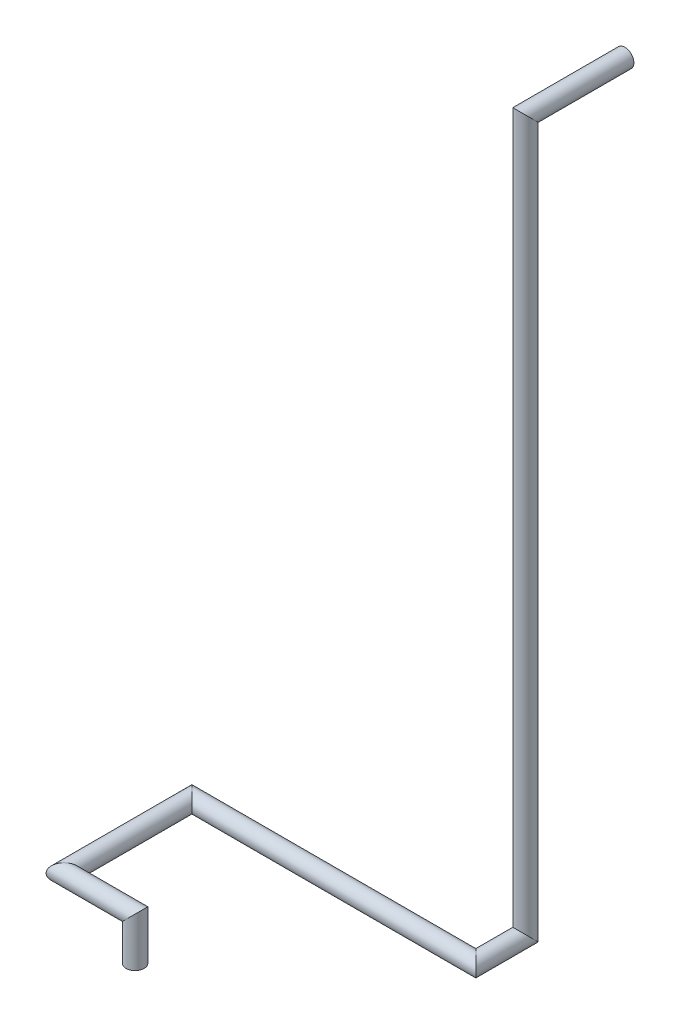
ISO-10303-21;
HEADER;
FILE_DESCRIPTION(('STEP AP214'),'2;1');
FILE_NAME('part.step','',(''),(''),'','','');
FILE_SCHEMA(('AUTOMOTIVE_DESIGN { 1 0 10303 214 1 1 1 1 }'));
ENDSEC;
DATA;
#1=APPLICATION_CONTEXT('core data for automotive mechanical design processes');
#2=APPLICATION_PROTOCOL_DEFINITION('international standard','automotive_design',2000,#1);
#3=PRODUCT_CONTEXT('',#1,'mechanical');
#4=PRODUCT('Part','Part','',(#3));
#5=PRODUCT_RELATED_PRODUCT_CATEGORY('part','',(#4));
#6=PRODUCT_DEFINITION_FORMATION('','',#4);
#7=PRODUCT_DEFINITION_CONTEXT('part definition',#1,'design');
#8=PRODUCT_DEFINITION('design','',#6,#7);
#9=PRODUCT_DEFINITION_SHAPE('','',#8);
#10=(LENGTH_UNIT() NAMED_UNIT(*) SI_UNIT(.MILLI.,.METRE.));
#11=(NAMED_UNIT(*) PLANE_ANGLE_UNIT() SI_UNIT($,.RADIAN.));
#12=(NAMED_UNIT(*) SI_UNIT($,.STERADIAN.) SOLID_ANGLE_UNIT());
#13=UNCERTAINTY_MEASURE_WITH_UNIT(LENGTH_MEASURE(1.E-05),#10,'distance_accuracy_value','');
#14=(GEOMETRIC_REPRESENTATION_CONTEXT(3) GLOBAL_UNCERTAINTY_ASSIGNED_CONTEXT((#13)) GLOBAL_UNIT_ASSIGNED_CONTEXT((#10,
#11,#12)) REPRESENTATION_CONTEXT('',''));
#15=CARTESIAN_POINT('',(0.,0.,0.));
#16=DIRECTION('',(0.,0.,1.));
#17=DIRECTION('',(1.,0.,0.));
#18=AXIS2_PLACEMENT_3D('',#15,#16,#17);
#19=CARTESIAN_POINT('',(0.,0.,50.));
#20=DIRECTION('',(0.,0.,-1.));
#21=DIRECTION('',(-1.,0.,0.));
#22=AXIS2_PLACEMENT_3D('',#19,#20,#21);
#23=CYLINDRICAL_SURFACE('',#22,12.7);
#24=CARTESIAN_POINT('',(0.,0.,0.));
#25=DIRECTION('',(0.,0.,1.));
#26=DIRECTION('',(1.,0.,0.));
#27=AXIS2_PLACEMENT_3D('',#24,#25,#26);
#28=CIRCLE('',#27,12.7);
#29=CARTESIAN_POINT('',(12.7,0.,0.));
#30=VERTEX_POINT('',#29);
#31=EDGE_CURVE('E11',#30,#30,#28,.T.);
#32=ORIENTED_EDGE('',*,*,#31,.T.);
#33=EDGE_LOOP('',(#32));
#34=FACE_BOUND('',#33,.T.);
#35=CARTESIAN_POINT('',(0.,0.,140.));
#36=DIRECTION('',(0.,-0.707106781186548,0.707106781186548));
#37=DIRECTION('',(0.,0.707106781186548,0.707106781186548));
#38=AXIS2_PLACEMENT_3D('',#35,#36,#37);
#39=ELLIPSE('',#38,17.9605122421383,12.7);
#40=CARTESIAN_POINT('',(0.,12.7,152.7));
#41=VERTEX_POINT('',#40);
#42=EDGE_CURVE('E42',#41,#41,#39,.F.);
#43=ORIENTED_EDGE('',*,*,#42,.T.);
#44=EDGE_LOOP('',(#43));
#45=FACE_BOUND('',#44,.T.);
#46=ADVANCED_FACE('F35',(#34,#45),#23,.T.);
#47=CARTESIAN_POINT('',(0.,0.,0.));
#48=DIRECTION('',(0.,0.,1.));
#49=DIRECTION('',(1.,0.,0.));
#50=AXIS2_PLACEMENT_3D('',#47,#48,#49);
#51=PLANE('',#50);
#52=ORIENTED_EDGE('',*,*,#31,.F.);
#53=EDGE_LOOP('',(#52));
#54=FACE_BOUND('',#53,.T.);
#55=ADVANCED_FACE('F103',(#54),#51,.F.);
#56=CARTESIAN_POINT('',(-300.,-1060.,390.));
#57=DIRECTION('',(0.,-1.,0.));
#58=DIRECTION('',(0.,0.,-1.));
#59=AXIS2_PLACEMENT_3D('',#56,#57,#58);
#60=PLANE('',#59);
#61=CARTESIAN_POINT('',(-300.,-1060.,390.));
#62=DIRECTION('',(0.,-1.,0.));
#63=DIRECTION('',(0.,0.,-1.));
#64=AXIS2_PLACEMENT_3D('',#61,#62,#63);
#65=CIRCLE('',#64,12.7);
#66=CARTESIAN_POINT('',(-300.,-1060.,377.3));
#67=VERTEX_POINT('',#66);
#68=EDGE_CURVE('E47',#67,#67,#65,.T.);
#69=ORIENTED_EDGE('',*,*,#68,.T.);
#70=EDGE_LOOP('',(#69));
#71=FACE_BOUND('',#70,.T.);
#72=ADVANCED_FACE('F100',(#71),#60,.T.);
#73=CARTESIAN_POINT('',(-300.,-971.96,390.));
#74=DIRECTION('',(0.,-1.,0.));
#75=DIRECTION('',(0.,0.,-1.));
#76=AXIS2_PLACEMENT_3D('',#73,#74,#75);
#77=CYLINDRICAL_SURFACE('',#76,12.7);
#78=CARTESIAN_POINT('',(-300.,-1000.,390.));
#79=DIRECTION('',(0.707106781186547,-0.707106781186547,0.));
#80=DIRECTION('',(0.707106781186548,0.707106781186548,0.));
#81=AXIS2_PLACEMENT_3D('',#78,#79,#80);
#82=ELLIPSE('',#81,17.9605122421383,12.7);
#83=CARTESIAN_POINT('',(-287.3,-987.3,390.));
#84=VERTEX_POINT('',#83);
#85=EDGE_CURVE('E52',#84,#84,#82,.F.);
#86=ORIENTED_EDGE('',*,*,#85,.F.);
#87=EDGE_LOOP('',(#86));
#88=FACE_BOUND('',#87,.T.);
#89=ORIENTED_EDGE('',*,*,#68,.F.);
#90=EDGE_LOOP('',(#89));
#91=FACE_BOUND('',#90,.T.);
#92=ADVANCED_FACE('F90',(#88,#91),#77,.T.);
#93=CARTESIAN_POINT('',(-414.07,-1000.,390.));
#94=DIRECTION('',(1.,0.,0.));
#95=DIRECTION('',(0.,0.,-1.));
#96=AXIS2_PLACEMENT_3D('',#93,#94,#95);
#97=CYLINDRICAL_SURFACE('',#96,12.7);
#98=CARTESIAN_POINT('',(-400.,-1000.,390.));
#99=DIRECTION('',(0.707106781186547,0.,0.707106781186547));
#100=DIRECTION('',(-0.707106781186548,0.,0.707106781186548));
#101=AXIS2_PLACEMENT_3D('',#98,#99,#100);
#102=ELLIPSE('',#101,17.9605122421383,12.7);
#103=CARTESIAN_POINT('',(-412.7,-1000.,402.7));
#104=VERTEX_POINT('',#103);
#105=EDGE_CURVE('E83',#104,#104,#102,.F.);
#106=ORIENTED_EDGE('',*,*,#105,.F.);
#107=EDGE_LOOP('',(#106));
#108=FACE_BOUND('',#107,.T.);
#109=ORIENTED_EDGE('',*,*,#85,.T.);
#110=EDGE_LOOP('',(#109));
#111=FACE_BOUND('',#110,.T.);
#112=ADVANCED_FACE('F87',(#108,#111),#97,.T.);
#113=CARTESIAN_POINT('',(-400.,-1000.,195.93));
#114=DIRECTION('',(0.,0.,1.));
#115=DIRECTION('',(1.,0.,0.));
#116=AXIS2_PLACEMENT_3D('',#113,#114,#115);
#117=CYLINDRICAL_SURFACE('',#116,12.7);
#118=CARTESIAN_POINT('',(-400.,-1000.,210.));
#119=DIRECTION('',(-0.707106781186548,0.,0.707106781186548));
#120=DIRECTION('',(-0.707106781186548,0.,-0.707106781186548));
#121=AXIS2_PLACEMENT_3D('',#118,#119,#120);
#122=ELLIPSE('',#121,17.9605122421383,12.7);
#123=CARTESIAN_POINT('',(-412.7,-1000.,197.3));
#124=VERTEX_POINT('',#123);
#125=EDGE_CURVE('E80',#124,#124,#122,.F.);
#126=ORIENTED_EDGE('',*,*,#125,.F.);
#127=EDGE_LOOP('',(#126));
#128=FACE_BOUND('',#127,.T.);
#129=ORIENTED_EDGE('',*,*,#105,.T.);
#130=EDGE_LOOP('',(#129));
#131=FACE_BOUND('',#130,.T.);
#132=ADVANCED_FACE('F89',(#128,#131),#117,.T.);
#133=CARTESIAN_POINT('',(14.07,-1000.,210.));
#134=DIRECTION('',(-1.,0.,0.));
#135=DIRECTION('',(0.,0.,1.));
#136=AXIS2_PLACEMENT_3D('',#133,#134,#135);
#137=CYLINDRICAL_SURFACE('',#136,12.7);
#138=CARTESIAN_POINT('',(0.,-1000.,210.));
#139=DIRECTION('',(-0.707106781186548,0.,0.707106781186548));
#140=DIRECTION('',(0.707106781186548,0.,0.707106781186548));
#141=AXIS2_PLACEMENT_3D('',#138,#139,#140);
#142=ELLIPSE('',#141,17.9605122421383,12.7);
#143=CARTESIAN_POINT('',(12.7,-1000.,222.7));
#144=VERTEX_POINT('',#143);
#145=EDGE_CURVE('E75',#144,#144,#142,.F.);
#146=ORIENTED_EDGE('',*,*,#145,.F.);
#147=EDGE_LOOP('',(#146));
#148=FACE_BOUND('',#147,.T.);
#149=ORIENTED_EDGE('',*,*,#125,.T.);
#150=EDGE_LOOP('',(#149));
#151=FACE_BOUND('',#150,.T.);
#152=ADVANCED_FACE('F97',(#148,#151),#137,.T.);
#153=CARTESIAN_POINT('',(0.,-1000.,111.96));
#154=DIRECTION('',(0.,0.,1.));
#155=DIRECTION('',(1.,0.,0.));
#156=AXIS2_PLACEMENT_3D('',#153,#154,#155);
#157=CYLINDRICAL_SURFACE('',#156,12.7);
#158=CARTESIAN_POINT('',(0.,-1000.,140.));
#159=DIRECTION('',(0.,-0.707106781186547,0.707106781186547));
#160=DIRECTION('',(0.,-0.707106781186548,-0.707106781186548));
#161=AXIS2_PLACEMENT_3D('',#158,#159,#160);
#162=ELLIPSE('',#161,17.9605122421383,12.7);
#163=CARTESIAN_POINT('',(0.,-1012.7,127.3));
#164=VERTEX_POINT('',#163);
#165=EDGE_CURVE('E72',#164,#164,#162,.F.);
#166=ORIENTED_EDGE('',*,*,#165,.F.);
#167=EDGE_LOOP('',(#166));
#168=FACE_BOUND('',#167,.T.);
#169=ORIENTED_EDGE('',*,*,#145,.T.);
#170=EDGE_LOOP('',(#169));
#171=FACE_BOUND('',#170,.T.);
#172=ADVANCED_FACE('F115',(#168,#171),#157,.T.);
#173=CARTESIAN_POINT('',(0.,28.04,140.));
#174=DIRECTION('',(0.,-1.,0.));
#175=DIRECTION('',(0.,0.,-1.));
#176=AXIS2_PLACEMENT_3D('',#173,#174,#175);
#177=CYLINDRICAL_SURFACE('',#176,12.7);
#178=ORIENTED_EDGE('',*,*,#42,.F.);
#179=EDGE_LOOP('',(#178));
#180=FACE_BOUND('',#179,.T.);
#181=ORIENTED_EDGE('',*,*,#165,.T.);
#182=EDGE_LOOP('',(#181));
#183=FACE_BOUND('',#182,.T.);
#184=ADVANCED_FACE('F69',(#180,#183),#177,.T.);
#185=CLOSED_SHELL('',(#46,#55,#72,#92,#112,#132,#152,#172,#184));
#186=MANIFOLD_SOLID_BREP('B2',#185);
#187=ADVANCED_BREP_SHAPE_REPRESENTATION('',(#18,#186),#14);
#188=SHAPE_DEFINITION_REPRESENTATION(#9,#187);
ENDSEC;
END-ISO-10303-21;
